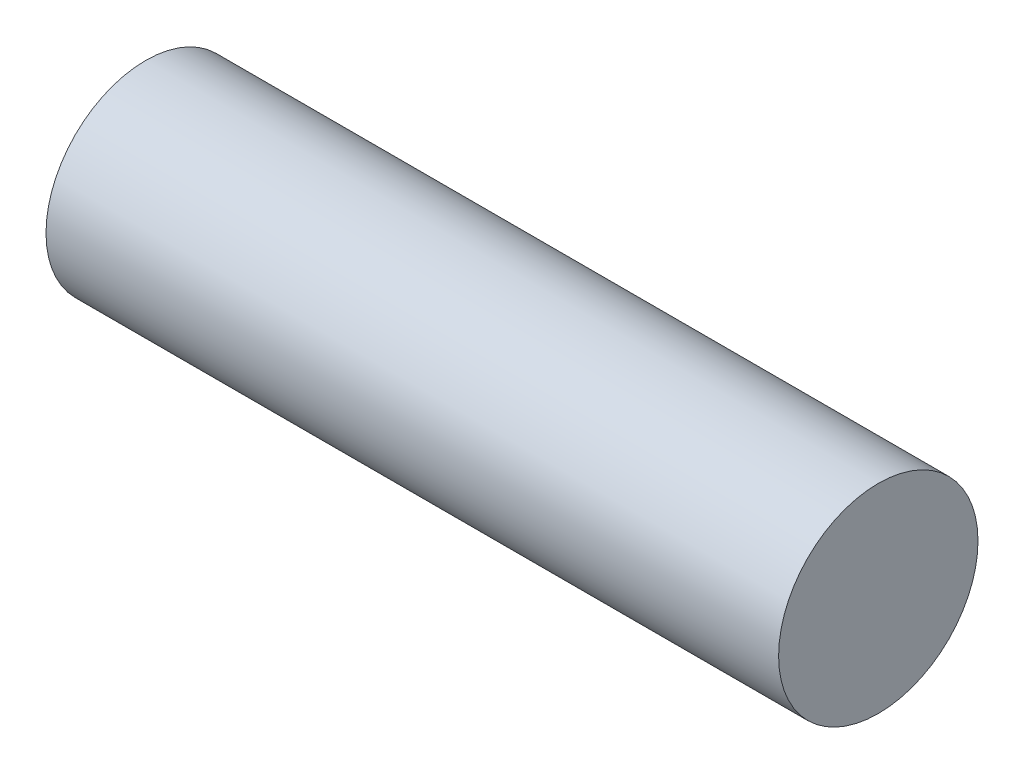
ISO-10303-21;
HEADER;
FILE_DESCRIPTION(('STEP AP214'),'2;1');
FILE_NAME('part.step','',(''),(''),'','','');
FILE_SCHEMA(('AUTOMOTIVE_DESIGN { 1 0 10303 214 1 1 1 1 }'));
ENDSEC;
DATA;
#1=APPLICATION_CONTEXT('core data for automotive mechanical design processes');
#2=APPLICATION_PROTOCOL_DEFINITION('international standard','automotive_design',2000,#1);
#3=PRODUCT_CONTEXT('',#1,'mechanical');
#4=PRODUCT('Part','Part','',(#3));
#5=PRODUCT_RELATED_PRODUCT_CATEGORY('part','',(#4));
#6=PRODUCT_DEFINITION_FORMATION('','',#4);
#7=PRODUCT_DEFINITION_CONTEXT('part definition',#1,'design');
#8=PRODUCT_DEFINITION('design','',#6,#7);
#9=PRODUCT_DEFINITION_SHAPE('','',#8);
#10=(LENGTH_UNIT() NAMED_UNIT(*) SI_UNIT(.MILLI.,.METRE.));
#11=(NAMED_UNIT(*) PLANE_ANGLE_UNIT() SI_UNIT($,.RADIAN.));
#12=(NAMED_UNIT(*) SI_UNIT($,.STERADIAN.) SOLID_ANGLE_UNIT());
#13=UNCERTAINTY_MEASURE_WITH_UNIT(LENGTH_MEASURE(1.E-05),#10,'distance_accuracy_value','');
#14=(GEOMETRIC_REPRESENTATION_CONTEXT(3) GLOBAL_UNCERTAINTY_ASSIGNED_CONTEXT((#13)) GLOBAL_UNIT_ASSIGNED_CONTEXT((#10,
#11,#12)) REPRESENTATION_CONTEXT('',''));
#15=CARTESIAN_POINT('',(0.,0.,0.));
#16=DIRECTION('',(0.,0.,1.));
#17=DIRECTION('',(1.,0.,0.));
#18=AXIS2_PLACEMENT_3D('',#15,#16,#17);
#19=CARTESIAN_POINT('',(66.5,0.,0.));
#20=DIRECTION('',(-1.,0.,0.));
#21=DIRECTION('',(0.,0.,1.));
#22=AXIS2_PLACEMENT_3D('',#19,#20,#21);
#23=CYLINDRICAL_SURFACE('',#22,9.05);
#24=CARTESIAN_POINT('',(66.5,0.,0.));
#25=DIRECTION('',(1.,0.,0.));
#26=DIRECTION('',(0.,0.,-1.));
#27=AXIS2_PLACEMENT_3D('',#24,#25,#26);
#28=CIRCLE('',#27,9.05);
#29=CARTESIAN_POINT('',(66.5,0.,-9.05));
#30=VERTEX_POINT('',#29);
#31=EDGE_CURVE('E10',#30,#30,#28,.T.);
#32=ORIENTED_EDGE('',*,*,#31,.F.);
#33=EDGE_LOOP('',(#32));
#34=FACE_BOUND('',#33,.T.);
#35=CARTESIAN_POINT('',(0.,0.,0.));
#36=DIRECTION('',(1.,0.,0.));
#37=DIRECTION('',(0.,0.,-1.));
#38=AXIS2_PLACEMENT_3D('',#35,#36,#37);
#39=CIRCLE('',#38,9.05);
#40=CARTESIAN_POINT('',(0.,0.,-9.05));
#41=VERTEX_POINT('',#40);
#42=EDGE_CURVE('E32',#41,#41,#39,.T.);
#43=ORIENTED_EDGE('',*,*,#42,.T.);
#44=EDGE_LOOP('',(#43));
#45=FACE_BOUND('',#44,.T.);
#46=ADVANCED_FACE('F29',(#34,#45),#23,.T.);
#47=CARTESIAN_POINT('',(66.5,0.,0.));
#48=DIRECTION('',(1.,0.,0.));
#49=DIRECTION('',(0.,0.,-1.));
#50=AXIS2_PLACEMENT_3D('',#47,#48,#49);
#51=PLANE('',#50);
#52=ORIENTED_EDGE('',*,*,#31,.T.);
#53=EDGE_LOOP('',(#52));
#54=FACE_BOUND('',#53,.T.);
#55=ADVANCED_FACE('F44',(#54),#51,.T.);
#56=CARTESIAN_POINT('',(0.,0.,0.));
#57=DIRECTION('',(1.,0.,0.));
#58=DIRECTION('',(0.,0.,-1.));
#59=AXIS2_PLACEMENT_3D('',#56,#57,#58);
#60=PLANE('',#59);
#61=ORIENTED_EDGE('',*,*,#42,.F.);
#62=EDGE_LOOP('',(#61));
#63=FACE_BOUND('',#62,.T.);
#64=ADVANCED_FACE('F42',(#63),#60,.F.);
#65=CLOSED_SHELL('',(#46,#55,#64));
#66=MANIFOLD_SOLID_BREP('B2',#65);
#67=ADVANCED_BREP_SHAPE_REPRESENTATION('',(#18,#66),#14);
#68=SHAPE_DEFINITION_REPRESENTATION(#9,#67);
ENDSEC;
END-ISO-10303-21;
